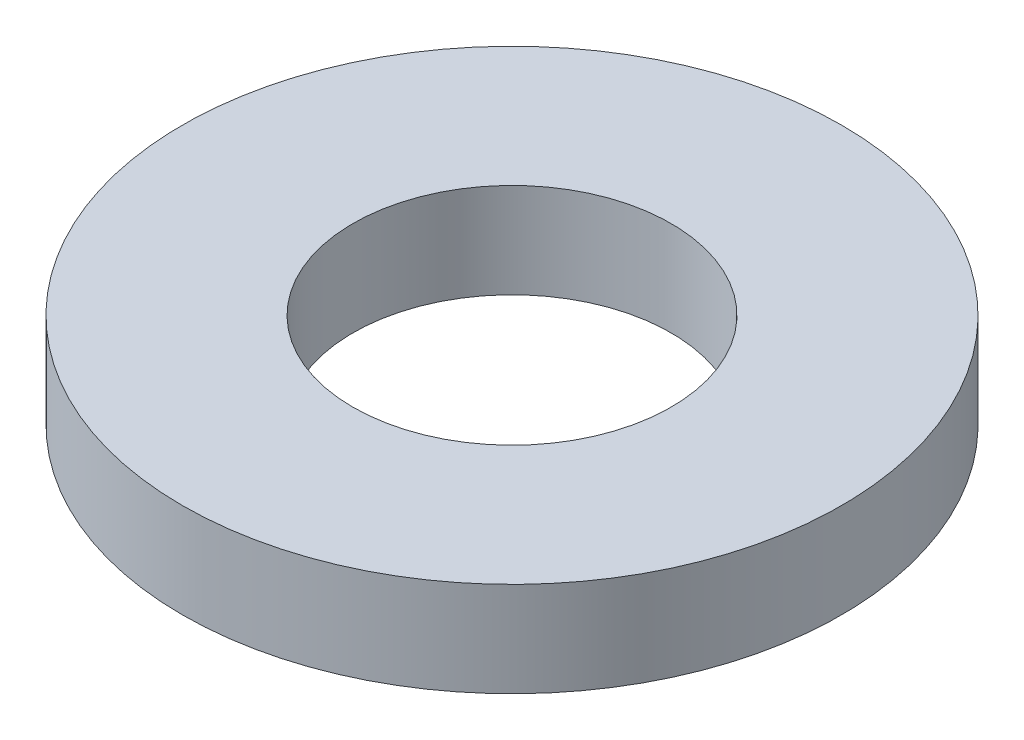
ISO-10303-21;
HEADER;
FILE_DESCRIPTION(('STEP AP214'),'2;1');
FILE_NAME('part.step','',(''),(''),'','','');
FILE_SCHEMA(('AUTOMOTIVE_DESIGN { 1 0 10303 214 1 1 1 1 }'));
ENDSEC;
DATA;
#1=APPLICATION_CONTEXT('core data for automotive mechanical design processes');
#2=APPLICATION_PROTOCOL_DEFINITION('international standard','automotive_design',2000,#1);
#3=PRODUCT_CONTEXT('',#1,'mechanical');
#4=PRODUCT('Part','Part','',(#3));
#5=PRODUCT_RELATED_PRODUCT_CATEGORY('part','',(#4));
#6=PRODUCT_DEFINITION_FORMATION('','',#4);
#7=PRODUCT_DEFINITION_CONTEXT('part definition',#1,'design');
#8=PRODUCT_DEFINITION('design','',#6,#7);
#9=PRODUCT_DEFINITION_SHAPE('','',#8);
#10=(LENGTH_UNIT() NAMED_UNIT(*) SI_UNIT(.MILLI.,.METRE.));
#11=(NAMED_UNIT(*) PLANE_ANGLE_UNIT() SI_UNIT($,.RADIAN.));
#12=(NAMED_UNIT(*) SI_UNIT($,.STERADIAN.) SOLID_ANGLE_UNIT());
#13=UNCERTAINTY_MEASURE_WITH_UNIT(LENGTH_MEASURE(1.E-05),#10,'distance_accuracy_value','');
#14=(GEOMETRIC_REPRESENTATION_CONTEXT(3) GLOBAL_UNCERTAINTY_ASSIGNED_CONTEXT((#13)) GLOBAL_UNIT_ASSIGNED_CONTEXT((#10,
#11,#12)) REPRESENTATION_CONTEXT('',''));
#15=CARTESIAN_POINT('',(0.,0.,0.));
#16=DIRECTION('',(0.,0.,1.));
#17=DIRECTION('',(1.,0.,0.));
#18=AXIS2_PLACEMENT_3D('',#15,#16,#17);
#19=CARTESIAN_POINT('',(44.6569470834061,-21.6371426298124,14.255311718141));
#20=DIRECTION('',(0.,1.,0.));
#21=DIRECTION('',(0.,0.,1.));
#22=AXIS2_PLACEMENT_3D('',#19,#20,#21);
#23=PLANE('',#22);
#24=CARTESIAN_POINT('',(36.857793900117,-21.6371426298124,10.4000283791901));
#25=DIRECTION('',(0.,1.,0.));
#26=DIRECTION('',(0.,0.,1.));
#27=AXIS2_PLACEMENT_3D('',#24,#25,#26);
#28=CIRCLE('',#27,4.20000000000001);
#29=CARTESIAN_POINT('',(36.857793900117,-21.6371426298124,14.6000283791901));
#30=VERTEX_POINT('',#29);
#31=EDGE_CURVE('E17',#30,#30,#28,.T.);
#32=ORIENTED_EDGE('',*,*,#31,.T.);
#33=EDGE_LOOP('',(#32));
#34=FACE_BOUND('',#33,.T.);
#35=CARTESIAN_POINT('',(36.857793900117,-21.6371426298124,10.4000283791901));
#36=DIRECTION('',(0.,1.,0.));
#37=DIRECTION('',(0.,0.,1.));
#38=AXIS2_PLACEMENT_3D('',#35,#36,#37);
#39=CIRCLE('',#38,8.7);
#40=CARTESIAN_POINT('',(36.857793900117,-21.6371426298124,19.1000283791901));
#41=VERTEX_POINT('',#40);
#42=EDGE_CURVE('E26',#41,#41,#39,.T.);
#43=ORIENTED_EDGE('',*,*,#42,.F.);
#44=EDGE_LOOP('',(#43));
#45=FACE_BOUND('',#44,.T.);
#46=ADVANCED_FACE('F14',(#34,#45),#23,.F.);
#47=CARTESIAN_POINT('',(36.857793900117,40.4361289751259,10.4000283791901));
#48=DIRECTION('',(0.,1.,0.));
#49=DIRECTION('',(0.,0.,1.));
#50=AXIS2_PLACEMENT_3D('',#47,#48,#49);
#51=CYLINDRICAL_SURFACE('',#50,4.20000000000001);
#52=CARTESIAN_POINT('',(36.857793900117,-19.1371426298123,10.4000283791901));
#53=DIRECTION('',(0.,1.,0.));
#54=DIRECTION('',(0.,0.,1.));
#55=AXIS2_PLACEMENT_3D('',#52,#53,#54);
#56=CIRCLE('',#55,4.20000000000001);
#57=CARTESIAN_POINT('',(36.857793900117,-19.1371426298123,14.6000283791901));
#58=VERTEX_POINT('',#57);
#59=EDGE_CURVE('E21',#58,#58,#56,.T.);
#60=ORIENTED_EDGE('',*,*,#59,.T.);
#61=EDGE_LOOP('',(#60));
#62=FACE_BOUND('',#61,.T.);
#63=ORIENTED_EDGE('',*,*,#31,.F.);
#64=EDGE_LOOP('',(#63));
#65=FACE_BOUND('',#64,.T.);
#66=ADVANCED_FACE('F36',(#62,#65),#51,.F.);
#67=CARTESIAN_POINT('',(36.857793900117,40.4361289751259,10.4000283791901));
#68=DIRECTION('',(0.,1.,0.));
#69=DIRECTION('',(0.,0.,1.));
#70=AXIS2_PLACEMENT_3D('',#67,#68,#69);
#71=CYLINDRICAL_SURFACE('',#70,8.7);
#72=ORIENTED_EDGE('',*,*,#42,.T.);
#73=EDGE_LOOP('',(#72));
#74=FACE_BOUND('',#73,.T.);
#75=CARTESIAN_POINT('',(36.857793900117,-19.1371426298124,10.4000283791901));
#76=DIRECTION('',(0.,1.,0.));
#77=DIRECTION('',(0.,0.,1.));
#78=AXIS2_PLACEMENT_3D('',#75,#76,#77);
#79=CIRCLE('',#78,8.7);
#80=CARTESIAN_POINT('',(36.857793900117,-19.1371426298124,19.1000283791901));
#81=VERTEX_POINT('',#80);
#82=EDGE_CURVE('E10',#81,#81,#79,.F.);
#83=ORIENTED_EDGE('',*,*,#82,.T.);
#84=EDGE_LOOP('',(#83));
#85=FACE_BOUND('',#84,.T.);
#86=ADVANCED_FACE('F38',(#74,#85),#71,.T.);
#87=CARTESIAN_POINT('',(40.622902333429,-19.1371426298124,12.2611996462699));
#88=DIRECTION('',(0.,-1.,0.));
#89=DIRECTION('',(0.,0.,-1.));
#90=AXIS2_PLACEMENT_3D('',#87,#88,#89);
#91=PLANE('',#90);
#92=ORIENTED_EDGE('',*,*,#82,.F.);
#93=EDGE_LOOP('',(#92));
#94=FACE_BOUND('',#93,.T.);
#95=ORIENTED_EDGE('',*,*,#59,.F.);
#96=EDGE_LOOP('',(#95));
#97=FACE_BOUND('',#96,.T.);
#98=ADVANCED_FACE('F45',(#94,#97),#91,.F.);
#99=CLOSED_SHELL('',(#46,#66,#86,#98));
#100=MANIFOLD_SOLID_BREP('B1',#99);
#101=ADVANCED_BREP_SHAPE_REPRESENTATION('',(#18,#100),#14);
#102=SHAPE_DEFINITION_REPRESENTATION(#9,#101);
ENDSEC;
END-ISO-10303-21;
